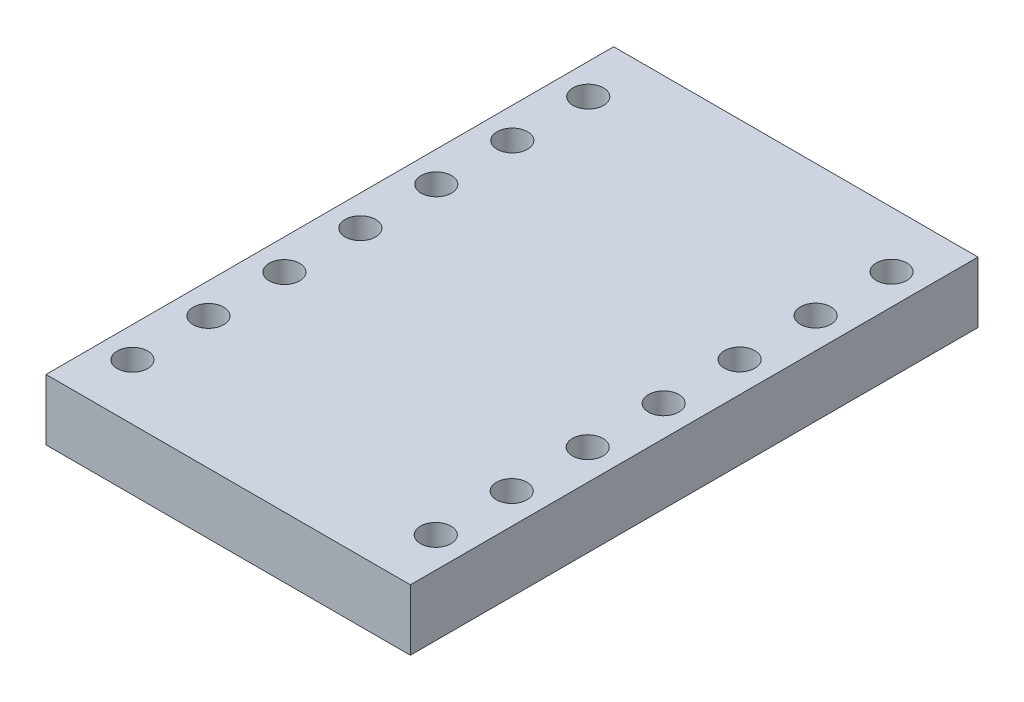
ISO-10303-21;
HEADER;
FILE_DESCRIPTION(('STEP AP214'),'2;1');
FILE_NAME('part.step','',(''),(''),'','','');
FILE_SCHEMA(('AUTOMOTIVE_DESIGN { 1 0 10303 214 1 1 1 1 }'));
ENDSEC;
DATA;
#1=APPLICATION_CONTEXT('core data for automotive mechanical design processes');
#2=APPLICATION_PROTOCOL_DEFINITION('international standard','automotive_design',2000,#1);
#3=PRODUCT_CONTEXT('',#1,'mechanical');
#4=PRODUCT('Part','Part','',(#3));
#5=PRODUCT_RELATED_PRODUCT_CATEGORY('part','',(#4));
#6=PRODUCT_DEFINITION_FORMATION('','',#4);
#7=PRODUCT_DEFINITION_CONTEXT('part definition',#1,'design');
#8=PRODUCT_DEFINITION('design','',#6,#7);
#9=PRODUCT_DEFINITION_SHAPE('','',#8);
#10=(LENGTH_UNIT() NAMED_UNIT(*) SI_UNIT(.MILLI.,.METRE.));
#11=(NAMED_UNIT(*) PLANE_ANGLE_UNIT() SI_UNIT($,.RADIAN.));
#12=(NAMED_UNIT(*) SI_UNIT($,.STERADIAN.) SOLID_ANGLE_UNIT());
#13=UNCERTAINTY_MEASURE_WITH_UNIT(LENGTH_MEASURE(1.E-05),#10,'distance_accuracy_value','');
#14=(GEOMETRIC_REPRESENTATION_CONTEXT(3) GLOBAL_UNCERTAINTY_ASSIGNED_CONTEXT((#13)) GLOBAL_UNIT_ASSIGNED_CONTEXT((#10,
#11,#12)) REPRESENTATION_CONTEXT('',''));
#15=CARTESIAN_POINT('',(0.,0.,0.));
#16=DIRECTION('',(0.,0.,1.));
#17=DIRECTION('',(1.,0.,0.));
#18=AXIS2_PLACEMENT_3D('',#15,#16,#17);
#19=CARTESIAN_POINT('',(0.,10.,0.));
#20=DIRECTION('',(1.,0.,0.));
#21=DIRECTION('',(0.,0.,-1.));
#22=AXIS2_PLACEMENT_3D('',#19,#20,#21);
#23=PLANE('',#22);
#24=CARTESIAN_POINT('',(0.,5.,12.75));
#25=DIRECTION('',(-1.,0.,0.));
#26=DIRECTION('',(0.,0.,1.));
#27=AXIS2_PLACEMENT_3D('',#24,#25,#26);
#28=CIRCLE('',#27,2.75);
#29=CARTESIAN_POINT('',(0.,5.,15.5));
#30=VERTEX_POINT('',#29);
#31=EDGE_CURVE('E167',#30,#30,#28,.T.);
#32=ORIENTED_EDGE('',*,*,#31,.F.);
#33=EDGE_LOOP('',(#32));
#34=FACE_BOUND('',#33,.T.);
#35=CARTESIAN_POINT('',(0.,5.,25.196));
#36=DIRECTION('',(-1.,0.,0.));
#37=DIRECTION('',(0.,0.,1.));
#38=AXIS2_PLACEMENT_3D('',#35,#36,#37);
#39=CIRCLE('',#38,2.75);
#40=CARTESIAN_POINT('',(0.,5.,27.946));
#41=VERTEX_POINT('',#40);
#42=EDGE_CURVE('E306',#41,#41,#39,.T.);
#43=ORIENTED_EDGE('',*,*,#42,.F.);
#44=EDGE_LOOP('',(#43));
#45=FACE_BOUND('',#44,.T.);
#46=CARTESIAN_POINT('',(0.,5.,37.642));
#47=DIRECTION('',(-1.,0.,0.));
#48=DIRECTION('',(0.,0.,1.));
#49=AXIS2_PLACEMENT_3D('',#46,#47,#48);
#50=CIRCLE('',#49,2.75);
#51=CARTESIAN_POINT('',(0.,5.,40.392));
#52=VERTEX_POINT('',#51);
#53=EDGE_CURVE('E310',#52,#52,#50,.T.);
#54=ORIENTED_EDGE('',*,*,#53,.F.);
#55=EDGE_LOOP('',(#54));
#56=FACE_BOUND('',#55,.T.);
#57=CARTESIAN_POINT('',(0.,5.,50.088));
#58=DIRECTION('',(-1.,0.,0.));
#59=DIRECTION('',(0.,0.,1.));
#60=AXIS2_PLACEMENT_3D('',#57,#58,#59);
#61=CIRCLE('',#60,2.75);
#62=CARTESIAN_POINT('',(0.,5.,52.838));
#63=VERTEX_POINT('',#62);
#64=EDGE_CURVE('E314',#63,#63,#61,.T.);
#65=ORIENTED_EDGE('',*,*,#64,.F.);
#66=EDGE_LOOP('',(#65));
#67=FACE_BOUND('',#66,.T.);
#68=DIRECTION('',(0.,0.,1.));
#69=VECTOR('',#68,1.);
#70=CARTESIAN_POINT('',(0.,0.,0.));
#71=LINE('',#70,#69);
#72=CARTESIAN_POINT('',(0.,0.,0.));
#73=VERTEX_POINT('',#72);
#74=CARTESIAN_POINT('',(0.,0.,63.));
#75=VERTEX_POINT('',#74);
#76=EDGE_CURVE('E137',#73,#75,#71,.T.);
#77=ORIENTED_EDGE('',*,*,#76,.T.);
#78=DIRECTION('',(0.,-1.,0.));
#79=VECTOR('',#78,1.);
#80=CARTESIAN_POINT('',(0.,10.,63.));
#81=LINE('',#80,#79);
#82=CARTESIAN_POINT('',(0.,10.,63.));
#83=VERTEX_POINT('',#82);
#84=EDGE_CURVE('E11',#83,#75,#81,.T.);
#85=ORIENTED_EDGE('',*,*,#84,.F.);
#86=DIRECTION('',(0.,0.,1.));
#87=VECTOR('',#86,1.);
#88=CARTESIAN_POINT('',(0.,10.,0.));
#89=LINE('',#88,#87);
#90=CARTESIAN_POINT('',(0.,10.,0.));
#91=VERTEX_POINT('',#90);
#92=EDGE_CURVE('E146',#91,#83,#89,.T.);
#93=ORIENTED_EDGE('',*,*,#92,.F.);
#94=DIRECTION('',(0.,-1.,0.));
#95=VECTOR('',#94,1.);
#96=CARTESIAN_POINT('',(0.,10.,0.));
#97=LINE('',#96,#95);
#98=EDGE_CURVE('E155',#91,#73,#97,.T.);
#99=ORIENTED_EDGE('',*,*,#98,.T.);
#100=EDGE_LOOP('',(#77,#85,#93,#99));
#101=FACE_BOUND('',#100,.T.);
#102=ADVANCED_FACE('F36',(#34,#45,#56,#67,#101),#23,.F.);
#103=CARTESIAN_POINT('',(0.,10.,63.));
#104=DIRECTION('',(0.,0.,-1.));
#105=DIRECTION('',(-1.,0.,0.));
#106=AXIS2_PLACEMENT_3D('',#103,#104,#105);
#107=PLANE('',#106);
#108=DIRECTION('',(1.,0.,0.));
#109=VECTOR('',#108,1.);
#110=CARTESIAN_POINT('',(0.,0.,63.));
#111=LINE('',#110,#109);
#112=CARTESIAN_POINT('',(10.,0.,63.));
#113=VERTEX_POINT('',#112);
#114=EDGE_CURVE('E140',#75,#113,#111,.T.);
#115=ORIENTED_EDGE('',*,*,#114,.T.);
#116=DIRECTION('',(0.,-1.,0.));
#117=VECTOR('',#116,1.);
#118=CARTESIAN_POINT('',(10.,10.,63.));
#119=LINE('',#118,#117);
#120=CARTESIAN_POINT('',(10.,10.,63.));
#121=VERTEX_POINT('',#120);
#122=EDGE_CURVE('E45',#121,#113,#119,.T.);
#123=ORIENTED_EDGE('',*,*,#122,.F.);
#124=DIRECTION('',(1.,0.,0.));
#125=VECTOR('',#124,1.);
#126=CARTESIAN_POINT('',(0.,10.,63.));
#127=LINE('',#126,#125);
#128=EDGE_CURVE('E80',#83,#121,#127,.T.);
#129=ORIENTED_EDGE('',*,*,#128,.F.);
#130=ORIENTED_EDGE('',*,*,#84,.T.);
#131=EDGE_LOOP('',(#115,#123,#129,#130));
#132=FACE_BOUND('',#131,.T.);
#133=ADVANCED_FACE('F294',(#132),#107,.F.);
#134=CARTESIAN_POINT('',(10.,10.,0.));
#135=DIRECTION('',(-1.,0.,0.));
#136=DIRECTION('',(0.,0.,1.));
#137=AXIS2_PLACEMENT_3D('',#134,#135,#136);
#138=PLANE('',#137);
#139=CARTESIAN_POINT('',(10.,5.,12.75));
#140=DIRECTION('',(-1.,0.,0.));
#141=DIRECTION('',(0.,0.,1.));
#142=AXIS2_PLACEMENT_3D('',#139,#140,#141);
#143=CIRCLE('',#142,2.75);
#144=CARTESIAN_POINT('',(10.,5.,15.5));
#145=VERTEX_POINT('',#144);
#146=EDGE_CURVE('E39',#145,#145,#143,.T.);
#147=ORIENTED_EDGE('',*,*,#146,.T.);
#148=EDGE_LOOP('',(#147));
#149=FACE_BOUND('',#148,.T.);
#150=CARTESIAN_POINT('',(10.,5.,25.196));
#151=DIRECTION('',(-1.,0.,0.));
#152=DIRECTION('',(0.,0.,1.));
#153=AXIS2_PLACEMENT_3D('',#150,#151,#152);
#154=CIRCLE('',#153,2.75);
#155=CARTESIAN_POINT('',(10.,5.,27.946));
#156=VERTEX_POINT('',#155);
#157=EDGE_CURVE('E169',#156,#156,#154,.T.);
#158=ORIENTED_EDGE('',*,*,#157,.T.);
#159=EDGE_LOOP('',(#158));
#160=FACE_BOUND('',#159,.T.);
#161=CARTESIAN_POINT('',(10.,5.,37.642));
#162=DIRECTION('',(-1.,0.,0.));
#163=DIRECTION('',(0.,0.,1.));
#164=AXIS2_PLACEMENT_3D('',#161,#162,#163);
#165=CIRCLE('',#164,2.75);
#166=CARTESIAN_POINT('',(10.,5.,40.392));
#167=VERTEX_POINT('',#166);
#168=EDGE_CURVE('E166',#167,#167,#165,.T.);
#169=ORIENTED_EDGE('',*,*,#168,.T.);
#170=EDGE_LOOP('',(#169));
#171=FACE_BOUND('',#170,.T.);
#172=CARTESIAN_POINT('',(10.,5.,50.088));
#173=DIRECTION('',(-1.,0.,0.));
#174=DIRECTION('',(0.,0.,1.));
#175=AXIS2_PLACEMENT_3D('',#172,#173,#174);
#176=CIRCLE('',#175,2.75);
#177=CARTESIAN_POINT('',(10.,5.,52.838));
#178=VERTEX_POINT('',#177);
#179=EDGE_CURVE('E163',#178,#178,#176,.T.);
#180=ORIENTED_EDGE('',*,*,#179,.T.);
#181=EDGE_LOOP('',(#180));
#182=FACE_BOUND('',#181,.T.);
#183=DIRECTION('',(0.,0.,-1.));
#184=VECTOR('',#183,1.);
#185=CARTESIAN_POINT('',(10.,0.,0.));
#186=LINE('',#185,#184);
#187=CARTESIAN_POINT('',(10.,0.,0.));
#188=VERTEX_POINT('',#187);
#189=EDGE_CURVE('E70',#113,#188,#186,.T.);
#190=ORIENTED_EDGE('',*,*,#189,.T.);
#191=DIRECTION('',(0.,-1.,0.));
#192=VECTOR('',#191,1.);
#193=CARTESIAN_POINT('',(10.,10.,0.));
#194=LINE('',#193,#192);
#195=CARTESIAN_POINT('',(10.,10.,0.));
#196=VERTEX_POINT('',#195);
#197=EDGE_CURVE('E54',#196,#188,#194,.T.);
#198=ORIENTED_EDGE('',*,*,#197,.F.);
#199=DIRECTION('',(0.,0.,-1.));
#200=VECTOR('',#199,1.);
#201=CARTESIAN_POINT('',(10.,10.,0.));
#202=LINE('',#201,#200);
#203=EDGE_CURVE('E150',#121,#196,#202,.T.);
#204=ORIENTED_EDGE('',*,*,#203,.F.);
#205=ORIENTED_EDGE('',*,*,#122,.T.);
#206=EDGE_LOOP('',(#190,#198,#204,#205));
#207=FACE_BOUND('',#206,.T.);
#208=ADVANCED_FACE('F299',(#149,#160,#171,#182,#207),#138,.F.);
#209=CARTESIAN_POINT('',(0.,10.,0.));
#210=DIRECTION('',(0.,0.,1.));
#211=DIRECTION('',(1.,0.,0.));
#212=AXIS2_PLACEMENT_3D('',#209,#210,#211);
#213=PLANE('',#212);
#214=DIRECTION('',(-1.,0.,0.));
#215=VECTOR('',#214,1.);
#216=CARTESIAN_POINT('',(0.,0.,0.));
#217=LINE('',#216,#215);
#218=EDGE_CURVE('E75',#188,#73,#217,.T.);
#219=ORIENTED_EDGE('',*,*,#218,.T.);
#220=ORIENTED_EDGE('',*,*,#98,.F.);
#221=DIRECTION('',(-1.,0.,0.));
#222=VECTOR('',#221,1.);
#223=CARTESIAN_POINT('',(0.,10.,0.));
#224=LINE('',#223,#222);
#225=EDGE_CURVE('E153',#196,#91,#224,.T.);
#226=ORIENTED_EDGE('',*,*,#225,.F.);
#227=ORIENTED_EDGE('',*,*,#197,.T.);
#228=EDGE_LOOP('',(#219,#220,#226,#227));
#229=FACE_BOUND('',#228,.T.);
#230=ADVANCED_FACE('F319',(#229),#213,.F.);
#231=CARTESIAN_POINT('',(0.,0.,0.));
#232=DIRECTION('',(0.,1.,0.));
#233=DIRECTION('',(0.,0.,1.));
#234=AXIS2_PLACEMENT_3D('',#231,#232,#233);
#235=PLANE('',#234);
#236=ORIENTED_EDGE('',*,*,#76,.F.);
#237=ORIENTED_EDGE('',*,*,#218,.F.);
#238=ORIENTED_EDGE('',*,*,#189,.F.);
#239=ORIENTED_EDGE('',*,*,#114,.F.);
#240=EDGE_LOOP('',(#236,#237,#238,#239));
#241=FACE_BOUND('',#240,.T.);
#242=ADVANCED_FACE('F317',(#241),#235,.F.);
#243=CARTESIAN_POINT('',(0.,10.,0.));
#244=DIRECTION('',(0.,1.,0.));
#245=DIRECTION('',(0.,0.,1.));
#246=AXIS2_PLACEMENT_3D('',#243,#244,#245);
#247=PLANE('',#246);
#248=DIRECTION('',(0.,0.,1.));
#249=VECTOR('',#248,1.);
#250=CARTESIAN_POINT('',(-24.845,10.,78.));
#251=LINE('',#250,#249);
#252=CARTESIAN_POINT('',(-24.845,10.,-15.));
#253=VERTEX_POINT('',#252);
#254=CARTESIAN_POINT('',(-24.845,10.,78.));
#255=VERTEX_POINT('',#254);
#256=EDGE_CURVE('E136',#253,#255,#251,.T.);
#257=ORIENTED_EDGE('',*,*,#256,.F.);
#258=DIRECTION('',(-1.,0.,0.));
#259=VECTOR('',#258,1.);
#260=CARTESIAN_POINT('',(34.845,10.,-15.));
#261=LINE('',#260,#259);
#262=CARTESIAN_POINT('',(34.845,10.,-15.));
#263=VERTEX_POINT('',#262);
#264=EDGE_CURVE('E132',#263,#253,#261,.T.);
#265=ORIENTED_EDGE('',*,*,#264,.F.);
#266=DIRECTION('',(0.,0.,-1.));
#267=VECTOR('',#266,1.);
#268=CARTESIAN_POINT('',(34.845,10.,78.));
#269=LINE('',#268,#267);
#270=CARTESIAN_POINT('',(34.845,10.,78.));
#271=VERTEX_POINT('',#270);
#272=EDGE_CURVE('E270',#271,#263,#269,.T.);
#273=ORIENTED_EDGE('',*,*,#272,.F.);
#274=DIRECTION('',(1.,0.,0.));
#275=VECTOR('',#274,1.);
#276=CARTESIAN_POINT('',(34.845,10.,78.));
#277=LINE('',#276,#275);
#278=EDGE_CURVE('E268',#255,#271,#277,.T.);
#279=ORIENTED_EDGE('',*,*,#278,.F.);
#280=EDGE_LOOP('',(#257,#265,#273,#279));
#281=FACE_BOUND('',#280,.T.);
#282=CARTESIAN_POINT('',(-19.845,10.,-5.83800003600001));
#283=DIRECTION('',(0.,1.,0.));
#284=DIRECTION('',(0.,0.,1.));
#285=AXIS2_PLACEMENT_3D('',#282,#283,#284);
#286=CIRCLE('',#285,2.5);
#287=CARTESIAN_POINT('',(-19.845,10.,-3.338000036));
#288=VERTEX_POINT('',#287);
#289=EDGE_CURVE('E256',#288,#288,#286,.T.);
#290=ORIENTED_EDGE('',*,*,#289,.T.);
#291=EDGE_LOOP('',(#290));
#292=FACE_BOUND('',#291,.T.);
#293=CARTESIAN_POINT('',(-19.8449999999999,10.,6.60799996399999));
#294=DIRECTION('',(0.,1.,0.));
#295=DIRECTION('',(0.,0.,1.));
#296=AXIS2_PLACEMENT_3D('',#293,#294,#295);
#297=CIRCLE('',#296,2.5);
#298=CARTESIAN_POINT('',(-19.8449999999999,10.,9.10799996399999));
#299=VERTEX_POINT('',#298);
#300=EDGE_CURVE('E250',#299,#299,#297,.T.);
#301=ORIENTED_EDGE('',*,*,#300,.T.);
#302=EDGE_LOOP('',(#301));
#303=FACE_BOUND('',#302,.T.);
#304=CARTESIAN_POINT('',(-19.8449999999997,10.,19.053999964));
#305=DIRECTION('',(0.,1.,0.));
#306=DIRECTION('',(0.,0.,1.));
#307=AXIS2_PLACEMENT_3D('',#304,#305,#306);
#308=CIRCLE('',#307,2.5);
#309=CARTESIAN_POINT('',(-19.8449999999997,10.,21.553999964));
#310=VERTEX_POINT('',#309);
#311=EDGE_CURVE('E244',#310,#310,#308,.T.);
#312=ORIENTED_EDGE('',*,*,#311,.T.);
#313=EDGE_LOOP('',(#312));
#314=FACE_BOUND('',#313,.T.);
#315=CARTESIAN_POINT('',(-19.8449999999996,10.,31.499999964));
#316=DIRECTION('',(0.,1.,0.));
#317=DIRECTION('',(0.,0.,1.));
#318=AXIS2_PLACEMENT_3D('',#315,#316,#317);
#319=CIRCLE('',#318,2.5);
#320=CARTESIAN_POINT('',(-19.8449999999996,10.,33.999999964));
#321=VERTEX_POINT('',#320);
#322=EDGE_CURVE('E238',#321,#321,#319,.T.);
#323=ORIENTED_EDGE('',*,*,#322,.T.);
#324=EDGE_LOOP('',(#323));
#325=FACE_BOUND('',#324,.T.);
#326=CARTESIAN_POINT('',(-19.8449999999995,10.,43.945999964));
#327=DIRECTION('',(0.,1.,0.));
#328=DIRECTION('',(0.,0.,1.));
#329=AXIS2_PLACEMENT_3D('',#326,#327,#328);
#330=CIRCLE('',#329,2.5);
#331=CARTESIAN_POINT('',(-19.8449999999995,10.,46.445999964));
#332=VERTEX_POINT('',#331);
#333=EDGE_CURVE('E232',#332,#332,#330,.T.);
#334=ORIENTED_EDGE('',*,*,#333,.T.);
#335=EDGE_LOOP('',(#334));
#336=FACE_BOUND('',#335,.T.);
#337=CARTESIAN_POINT('',(-19.8449999999993,10.,56.391999964));
#338=DIRECTION('',(0.,1.,0.));
#339=DIRECTION('',(0.,0.,1.));
#340=AXIS2_PLACEMENT_3D('',#337,#338,#339);
#341=CIRCLE('',#340,2.5);
#342=CARTESIAN_POINT('',(-19.8449999999993,10.,58.891999964));
#343=VERTEX_POINT('',#342);
#344=EDGE_CURVE('E226',#343,#343,#341,.T.);
#345=ORIENTED_EDGE('',*,*,#344,.T.);
#346=EDGE_LOOP('',(#345));
#347=FACE_BOUND('',#346,.T.);
#348=CARTESIAN_POINT('',(-19.8449999999992,10.,68.837999964));
#349=DIRECTION('',(0.,1.,0.));
#350=DIRECTION('',(0.,0.,1.));
#351=AXIS2_PLACEMENT_3D('',#348,#349,#350);
#352=CIRCLE('',#351,2.5);
#353=CARTESIAN_POINT('',(-19.8449999999992,10.,71.337999964));
#354=VERTEX_POINT('',#353);
#355=EDGE_CURVE('E220',#354,#354,#352,.T.);
#356=ORIENTED_EDGE('',*,*,#355,.T.);
#357=EDGE_LOOP('',(#356));
#358=FACE_BOUND('',#357,.T.);
#359=CARTESIAN_POINT('',(29.845,10.,-5.838000036));
#360=DIRECTION('',(0.,1.,0.));
#361=DIRECTION('',(0.,0.,1.));
#362=AXIS2_PLACEMENT_3D('',#359,#360,#361);
#363=CIRCLE('',#362,2.49999999999999);
#364=CARTESIAN_POINT('',(29.845,10.,-3.33800003600001));
#365=VERTEX_POINT('',#364);
#366=EDGE_CURVE('E214',#365,#365,#363,.T.);
#367=ORIENTED_EDGE('',*,*,#366,.T.);
#368=EDGE_LOOP('',(#367));
#369=FACE_BOUND('',#368,.T.);
#370=CARTESIAN_POINT('',(29.8450000000001,10.,6.60799996399999));
#371=DIRECTION('',(0.,1.,0.));
#372=DIRECTION('',(0.,0.,1.));
#373=AXIS2_PLACEMENT_3D('',#370,#371,#372);
#374=CIRCLE('',#373,2.49999999999999);
#375=CARTESIAN_POINT('',(29.8450000000001,10.,9.10799996399999));
#376=VERTEX_POINT('',#375);
#377=EDGE_CURVE('E208',#376,#376,#374,.T.);
#378=ORIENTED_EDGE('',*,*,#377,.T.);
#379=EDGE_LOOP('',(#378));
#380=FACE_BOUND('',#379,.T.);
#381=CARTESIAN_POINT('',(29.8450000000003,10.,19.053999964));
#382=DIRECTION('',(0.,1.,0.));
#383=DIRECTION('',(0.,0.,1.));
#384=AXIS2_PLACEMENT_3D('',#381,#382,#383);
#385=CIRCLE('',#384,2.5);
#386=CARTESIAN_POINT('',(29.8450000000003,10.,21.553999964));
#387=VERTEX_POINT('',#386);
#388=EDGE_CURVE('E202',#387,#387,#385,.T.);
#389=ORIENTED_EDGE('',*,*,#388,.T.);
#390=EDGE_LOOP('',(#389));
#391=FACE_BOUND('',#390,.T.);
#392=CARTESIAN_POINT('',(29.8450000000004,10.,31.499999964));
#393=DIRECTION('',(0.,1.,0.));
#394=DIRECTION('',(0.,0.,1.));
#395=AXIS2_PLACEMENT_3D('',#392,#393,#394);
#396=CIRCLE('',#395,2.5);
#397=CARTESIAN_POINT('',(29.8450000000004,10.,33.999999964));
#398=VERTEX_POINT('',#397);
#399=EDGE_CURVE('E196',#398,#398,#396,.T.);
#400=ORIENTED_EDGE('',*,*,#399,.T.);
#401=EDGE_LOOP('',(#400));
#402=FACE_BOUND('',#401,.T.);
#403=CARTESIAN_POINT('',(29.8450000000005,10.,43.945999964));
#404=DIRECTION('',(0.,1.,0.));
#405=DIRECTION('',(0.,0.,1.));
#406=AXIS2_PLACEMENT_3D('',#403,#404,#405);
#407=CIRCLE('',#406,2.5);
#408=CARTESIAN_POINT('',(29.8450000000005,10.,46.445999964));
#409=VERTEX_POINT('',#408);
#410=EDGE_CURVE('E190',#409,#409,#407,.T.);
#411=ORIENTED_EDGE('',*,*,#410,.T.);
#412=EDGE_LOOP('',(#411));
#413=FACE_BOUND('',#412,.T.);
#414=CARTESIAN_POINT('',(29.8450000000007,10.,56.391999964));
#415=DIRECTION('',(0.,1.,0.));
#416=DIRECTION('',(0.,0.,1.));
#417=AXIS2_PLACEMENT_3D('',#414,#415,#416);
#418=CIRCLE('',#417,2.5);
#419=CARTESIAN_POINT('',(29.8450000000007,10.,58.891999964));
#420=VERTEX_POINT('',#419);
#421=EDGE_CURVE('E183',#420,#420,#418,.T.);
#422=ORIENTED_EDGE('',*,*,#421,.T.);
#423=EDGE_LOOP('',(#422));
#424=FACE_BOUND('',#423,.T.);
#425=CARTESIAN_POINT('',(29.8450000000008,10.,68.837999964));
#426=DIRECTION('',(0.,1.,0.));
#427=DIRECTION('',(0.,0.,1.));
#428=AXIS2_PLACEMENT_3D('',#425,#426,#427);
#429=CIRCLE('',#428,2.5);
#430=CARTESIAN_POINT('',(29.8450000000008,10.,71.337999964));
#431=VERTEX_POINT('',#430);
#432=EDGE_CURVE('E174',#431,#431,#429,.T.);
#433=ORIENTED_EDGE('',*,*,#432,.T.);
#434=EDGE_LOOP('',(#433));
#435=FACE_BOUND('',#434,.T.);
#436=ORIENTED_EDGE('',*,*,#225,.T.);
#437=ORIENTED_EDGE('',*,*,#92,.T.);
#438=ORIENTED_EDGE('',*,*,#128,.T.);
#439=ORIENTED_EDGE('',*,*,#203,.T.);
#440=EDGE_LOOP('',(#436,#437,#438,#439));
#441=FACE_BOUND('',#440,.T.);
#442=ADVANCED_FACE('F281',(#281,#292,#303,#314,#325,#336,#347,#358,#369,#380,#391,#402,#413,
#424,#435,#441),#247,.F.);
#443=CARTESIAN_POINT('',(0.,20.,0.));
#444=DIRECTION('',(0.,1.,0.));
#445=DIRECTION('',(0.,0.,1.));
#446=AXIS2_PLACEMENT_3D('',#443,#444,#445);
#447=PLANE('',#446);
#448=CARTESIAN_POINT('',(29.8450000000007,20.,56.391999964));
#449=DIRECTION('',(0.,1.,0.));
#450=DIRECTION('',(0.,0.,1.));
#451=AXIS2_PLACEMENT_3D('',#448,#449,#450);
#452=CIRCLE('',#451,2.5);
#453=CARTESIAN_POINT('',(29.8450000000007,20.,58.891999964));
#454=VERTEX_POINT('',#453);
#455=EDGE_CURVE('E187',#454,#454,#452,.T.);
#456=ORIENTED_EDGE('',*,*,#455,.F.);
#457=EDGE_LOOP('',(#456));
#458=FACE_BOUND('',#457,.T.);
#459=CARTESIAN_POINT('',(29.8450000000004,20.,31.499999964));
#460=DIRECTION('',(0.,1.,0.));
#461=DIRECTION('',(0.,0.,1.));
#462=AXIS2_PLACEMENT_3D('',#459,#460,#461);
#463=CIRCLE('',#462,2.5);
#464=CARTESIAN_POINT('',(29.8450000000004,20.,33.999999964));
#465=VERTEX_POINT('',#464);
#466=EDGE_CURVE('E199',#465,#465,#463,.T.);
#467=ORIENTED_EDGE('',*,*,#466,.F.);
#468=EDGE_LOOP('',(#467));
#469=FACE_BOUND('',#468,.T.);
#470=CARTESIAN_POINT('',(29.8450000000001,20.,6.60799996399999));
#471=DIRECTION('',(0.,1.,0.));
#472=DIRECTION('',(0.,0.,1.));
#473=AXIS2_PLACEMENT_3D('',#470,#471,#472);
#474=CIRCLE('',#473,2.49999999999999);
#475=CARTESIAN_POINT('',(29.8450000000001,20.,9.10799996399999));
#476=VERTEX_POINT('',#475);
#477=EDGE_CURVE('E211',#476,#476,#474,.T.);
#478=ORIENTED_EDGE('',*,*,#477,.F.);
#479=EDGE_LOOP('',(#478));
#480=FACE_BOUND('',#479,.T.);
#481=CARTESIAN_POINT('',(-19.8449999999992,20.,68.837999964));
#482=DIRECTION('',(0.,1.,0.));
#483=DIRECTION('',(0.,0.,1.));
#484=AXIS2_PLACEMENT_3D('',#481,#482,#483);
#485=CIRCLE('',#484,2.5);
#486=CARTESIAN_POINT('',(-19.8449999999992,20.,71.337999964));
#487=VERTEX_POINT('',#486);
#488=EDGE_CURVE('E223',#487,#487,#485,.T.);
#489=ORIENTED_EDGE('',*,*,#488,.F.);
#490=EDGE_LOOP('',(#489));
#491=FACE_BOUND('',#490,.T.);
#492=CARTESIAN_POINT('',(-19.8449999999995,20.,43.945999964));
#493=DIRECTION('',(0.,1.,0.));
#494=DIRECTION('',(0.,0.,1.));
#495=AXIS2_PLACEMENT_3D('',#492,#493,#494);
#496=CIRCLE('',#495,2.5);
#497=CARTESIAN_POINT('',(-19.8449999999995,20.,46.445999964));
#498=VERTEX_POINT('',#497);
#499=EDGE_CURVE('E235',#498,#498,#496,.T.);
#500=ORIENTED_EDGE('',*,*,#499,.F.);
#501=EDGE_LOOP('',(#500));
#502=FACE_BOUND('',#501,.T.);
#503=CARTESIAN_POINT('',(-19.8449999999997,20.,19.053999964));
#504=DIRECTION('',(0.,1.,0.));
#505=DIRECTION('',(0.,0.,1.));
#506=AXIS2_PLACEMENT_3D('',#503,#504,#505);
#507=CIRCLE('',#506,2.5);
#508=CARTESIAN_POINT('',(-19.8449999999997,20.,21.553999964));
#509=VERTEX_POINT('',#508);
#510=EDGE_CURVE('E247',#509,#509,#507,.T.);
#511=ORIENTED_EDGE('',*,*,#510,.F.);
#512=EDGE_LOOP('',(#511));
#513=FACE_BOUND('',#512,.T.);
#514=CARTESIAN_POINT('',(-19.845,20.,-5.83800003600001));
#515=DIRECTION('',(0.,1.,0.));
#516=DIRECTION('',(0.,0.,1.));
#517=AXIS2_PLACEMENT_3D('',#514,#515,#516);
#518=CIRCLE('',#517,2.5);
#519=CARTESIAN_POINT('',(-19.845,20.,-3.338000036));
#520=VERTEX_POINT('',#519);
#521=EDGE_CURVE('E259',#520,#520,#518,.T.);
#522=ORIENTED_EDGE('',*,*,#521,.F.);
#523=EDGE_LOOP('',(#522));
#524=FACE_BOUND('',#523,.T.);
#525=DIRECTION('',(0.,0.,1.));
#526=VECTOR('',#525,1.);
#527=CARTESIAN_POINT('',(-24.845,20.,78.));
#528=LINE('',#527,#526);
#529=CARTESIAN_POINT('',(-24.845,20.,-15.));
#530=VERTEX_POINT('',#529);
#531=CARTESIAN_POINT('',(-24.845,20.,78.));
#532=VERTEX_POINT('',#531);
#533=EDGE_CURVE('E122',#530,#532,#528,.T.);
#534=ORIENTED_EDGE('',*,*,#533,.T.);
#535=DIRECTION('',(1.,0.,0.));
#536=VECTOR('',#535,1.);
#537=CARTESIAN_POINT('',(34.845,20.,78.));
#538=LINE('',#537,#536);
#539=CARTESIAN_POINT('',(34.845,20.,78.));
#540=VERTEX_POINT('',#539);
#541=EDGE_CURVE('E111',#532,#540,#538,.T.);
#542=ORIENTED_EDGE('',*,*,#541,.T.);
#543=DIRECTION('',(0.,0.,-1.));
#544=VECTOR('',#543,1.);
#545=CARTESIAN_POINT('',(34.845,20.,78.));
#546=LINE('',#545,#544);
#547=CARTESIAN_POINT('',(34.845,20.,-15.));
#548=VERTEX_POINT('',#547);
#549=EDGE_CURVE('E121',#540,#548,#546,.T.);
#550=ORIENTED_EDGE('',*,*,#549,.T.);
#551=DIRECTION('',(-1.,0.,0.));
#552=VECTOR('',#551,1.);
#553=CARTESIAN_POINT('',(34.845,20.,-15.));
#554=LINE('',#553,#552);
#555=EDGE_CURVE('E128',#548,#530,#554,.T.);
#556=ORIENTED_EDGE('',*,*,#555,.T.);
#557=EDGE_LOOP('',(#534,#542,#550,#556));
#558=FACE_BOUND('',#557,.T.);
#559=CARTESIAN_POINT('',(-19.8449999999999,20.,6.60799996399999));
#560=DIRECTION('',(0.,1.,0.));
#561=DIRECTION('',(0.,0.,1.));
#562=AXIS2_PLACEMENT_3D('',#559,#560,#561);
#563=CIRCLE('',#562,2.5);
#564=CARTESIAN_POINT('',(-19.8449999999999,20.,9.10799996399999));
#565=VERTEX_POINT('',#564);
#566=EDGE_CURVE('E253',#565,#565,#563,.T.);
#567=ORIENTED_EDGE('',*,*,#566,.F.);
#568=EDGE_LOOP('',(#567));
#569=FACE_BOUND('',#568,.T.);
#570=CARTESIAN_POINT('',(-19.8449999999996,20.,31.499999964));
#571=DIRECTION('',(0.,1.,0.));
#572=DIRECTION('',(0.,0.,1.));
#573=AXIS2_PLACEMENT_3D('',#570,#571,#572);
#574=CIRCLE('',#573,2.5);
#575=CARTESIAN_POINT('',(-19.8449999999996,20.,33.999999964));
#576=VERTEX_POINT('',#575);
#577=EDGE_CURVE('E241',#576,#576,#574,.T.);
#578=ORIENTED_EDGE('',*,*,#577,.F.);
#579=EDGE_LOOP('',(#578));
#580=FACE_BOUND('',#579,.T.);
#581=CARTESIAN_POINT('',(-19.8449999999993,20.,56.391999964));
#582=DIRECTION('',(0.,1.,0.));
#583=DIRECTION('',(0.,0.,1.));
#584=AXIS2_PLACEMENT_3D('',#581,#582,#583);
#585=CIRCLE('',#584,2.5);
#586=CARTESIAN_POINT('',(-19.8449999999993,20.,58.891999964));
#587=VERTEX_POINT('',#586);
#588=EDGE_CURVE('E229',#587,#587,#585,.T.);
#589=ORIENTED_EDGE('',*,*,#588,.F.);
#590=EDGE_LOOP('',(#589));
#591=FACE_BOUND('',#590,.T.);
#592=CARTESIAN_POINT('',(29.845,20.,-5.838000036));
#593=DIRECTION('',(0.,1.,0.));
#594=DIRECTION('',(0.,0.,1.));
#595=AXIS2_PLACEMENT_3D('',#592,#593,#594);
#596=CIRCLE('',#595,2.49999999999999);
#597=CARTESIAN_POINT('',(29.845,20.,-3.33800003600001));
#598=VERTEX_POINT('',#597);
#599=EDGE_CURVE('E217',#598,#598,#596,.T.);
#600=ORIENTED_EDGE('',*,*,#599,.F.);
#601=EDGE_LOOP('',(#600));
#602=FACE_BOUND('',#601,.T.);
#603=CARTESIAN_POINT('',(29.8450000000003,20.,19.053999964));
#604=DIRECTION('',(0.,1.,0.));
#605=DIRECTION('',(0.,0.,1.));
#606=AXIS2_PLACEMENT_3D('',#603,#604,#605);
#607=CIRCLE('',#606,2.5);
#608=CARTESIAN_POINT('',(29.8450000000003,20.,21.553999964));
#609=VERTEX_POINT('',#608);
#610=EDGE_CURVE('E205',#609,#609,#607,.T.);
#611=ORIENTED_EDGE('',*,*,#610,.F.);
#612=EDGE_LOOP('',(#611));
#613=FACE_BOUND('',#612,.T.);
#614=CARTESIAN_POINT('',(29.8450000000005,20.,43.945999964));
#615=DIRECTION('',(0.,1.,0.));
#616=DIRECTION('',(0.,0.,1.));
#617=AXIS2_PLACEMENT_3D('',#614,#615,#616);
#618=CIRCLE('',#617,2.5);
#619=CARTESIAN_POINT('',(29.8450000000005,20.,46.445999964));
#620=VERTEX_POINT('',#619);
#621=EDGE_CURVE('E193',#620,#620,#618,.T.);
#622=ORIENTED_EDGE('',*,*,#621,.F.);
#623=EDGE_LOOP('',(#622));
#624=FACE_BOUND('',#623,.T.);
#625=CARTESIAN_POINT('',(29.8450000000008,20.,68.837999964));
#626=DIRECTION('',(0.,1.,0.));
#627=DIRECTION('',(0.,0.,1.));
#628=AXIS2_PLACEMENT_3D('',#625,#626,#627);
#629=CIRCLE('',#628,2.5);
#630=CARTESIAN_POINT('',(29.8450000000008,20.,71.337999964));
#631=VERTEX_POINT('',#630);
#632=EDGE_CURVE('E178',#631,#631,#629,.T.);
#633=ORIENTED_EDGE('',*,*,#632,.F.);
#634=EDGE_LOOP('',(#633));
#635=FACE_BOUND('',#634,.T.);
#636=ADVANCED_FACE('F125',(#458,#469,#480,#491,#502,#513,#524,#558,#569,#580,#591,#602,#613,
#624,#635),#447,.T.);
#637=CARTESIAN_POINT('',(-24.845,20.,78.));
#638=DIRECTION('',(1.,0.,0.));
#639=DIRECTION('',(0.,0.,-1.));
#640=AXIS2_PLACEMENT_3D('',#637,#638,#639);
#641=PLANE('',#640);
#642=ORIENTED_EDGE('',*,*,#256,.T.);
#643=DIRECTION('',(0.,-1.,0.));
#644=VECTOR('',#643,1.);
#645=CARTESIAN_POINT('',(-24.845,20.,78.));
#646=LINE('',#645,#644);
#647=EDGE_CURVE('E115',#532,#255,#646,.T.);
#648=ORIENTED_EDGE('',*,*,#647,.F.);
#649=ORIENTED_EDGE('',*,*,#533,.F.);
#650=DIRECTION('',(0.,-1.,0.));
#651=VECTOR('',#650,1.);
#652=CARTESIAN_POINT('',(-24.845,20.,-15.));
#653=LINE('',#652,#651);
#654=EDGE_CURVE('E266',#530,#253,#653,.T.);
#655=ORIENTED_EDGE('',*,*,#654,.T.);
#656=EDGE_LOOP('',(#642,#648,#649,#655));
#657=FACE_BOUND('',#656,.T.);
#658=ADVANCED_FACE('F134',(#657),#641,.F.);
#659=CARTESIAN_POINT('',(34.845,20.,78.));
#660=DIRECTION('',(0.,0.,-1.));
#661=DIRECTION('',(-1.,0.,0.));
#662=AXIS2_PLACEMENT_3D('',#659,#660,#661);
#663=PLANE('',#662);
#664=ORIENTED_EDGE('',*,*,#278,.T.);
#665=DIRECTION('',(0.,-1.,0.));
#666=VECTOR('',#665,1.);
#667=CARTESIAN_POINT('',(34.845,20.,78.));
#668=LINE('',#667,#666);
#669=EDGE_CURVE('E118',#540,#271,#668,.T.);
#670=ORIENTED_EDGE('',*,*,#669,.F.);
#671=ORIENTED_EDGE('',*,*,#541,.F.);
#672=ORIENTED_EDGE('',*,*,#647,.T.);
#673=EDGE_LOOP('',(#664,#670,#671,#672));
#674=FACE_BOUND('',#673,.T.);
#675=ADVANCED_FACE('F113',(#674),#663,.F.);
#676=CARTESIAN_POINT('',(34.845,20.,78.));
#677=DIRECTION('',(-1.,0.,0.));
#678=DIRECTION('',(0.,0.,1.));
#679=AXIS2_PLACEMENT_3D('',#676,#677,#678);
#680=PLANE('',#679);
#681=ORIENTED_EDGE('',*,*,#272,.T.);
#682=DIRECTION('',(0.,-1.,0.));
#683=VECTOR('',#682,1.);
#684=CARTESIAN_POINT('',(34.845,20.,-15.));
#685=LINE('',#684,#683);
#686=EDGE_CURVE('E142',#548,#263,#685,.T.);
#687=ORIENTED_EDGE('',*,*,#686,.F.);
#688=ORIENTED_EDGE('',*,*,#549,.F.);
#689=ORIENTED_EDGE('',*,*,#669,.T.);
#690=EDGE_LOOP('',(#681,#687,#688,#689));
#691=FACE_BOUND('',#690,.T.);
#692=ADVANCED_FACE('F283',(#691),#680,.F.);
#693=CARTESIAN_POINT('',(34.845,20.,-15.));
#694=DIRECTION('',(0.,0.,1.));
#695=DIRECTION('',(1.,0.,0.));
#696=AXIS2_PLACEMENT_3D('',#693,#694,#695);
#697=PLANE('',#696);
#698=ORIENTED_EDGE('',*,*,#264,.T.);
#699=ORIENTED_EDGE('',*,*,#654,.F.);
#700=ORIENTED_EDGE('',*,*,#555,.F.);
#701=ORIENTED_EDGE('',*,*,#686,.T.);
#702=EDGE_LOOP('',(#698,#699,#700,#701));
#703=FACE_BOUND('',#702,.T.);
#704=ADVANCED_FACE('F277',(#703),#697,.F.);
#705=CARTESIAN_POINT('',(-19.845,20.,-5.83800003600001));
#706=DIRECTION('',(0.,-1.,0.));
#707=DIRECTION('',(0.,0.,-1.));
#708=AXIS2_PLACEMENT_3D('',#705,#706,#707);
#709=CYLINDRICAL_SURFACE('',#708,2.5);
#710=ORIENTED_EDGE('',*,*,#521,.T.);
#711=EDGE_LOOP('',(#710));
#712=FACE_BOUND('',#711,.T.);
#713=ORIENTED_EDGE('',*,*,#289,.F.);
#714=EDGE_LOOP('',(#713));
#715=FACE_BOUND('',#714,.T.);
#716=ADVANCED_FACE('F290',(#712,#715),#709,.F.);
#717=CARTESIAN_POINT('',(-19.8449999999999,20.,6.60799996399999));
#718=DIRECTION('',(0.,-1.,0.));
#719=DIRECTION('',(0.,0.,-1.));
#720=AXIS2_PLACEMENT_3D('',#717,#718,#719);
#721=CYLINDRICAL_SURFACE('',#720,2.5);
#722=ORIENTED_EDGE('',*,*,#566,.T.);
#723=EDGE_LOOP('',(#722));
#724=FACE_BOUND('',#723,.T.);
#725=ORIENTED_EDGE('',*,*,#300,.F.);
#726=EDGE_LOOP('',(#725));
#727=FACE_BOUND('',#726,.T.);
#728=ADVANCED_FACE('F344',(#724,#727),#721,.F.);
#729=CARTESIAN_POINT('',(-19.8449999999997,20.,19.053999964));
#730=DIRECTION('',(0.,-1.,0.));
#731=DIRECTION('',(0.,0.,-1.));
#732=AXIS2_PLACEMENT_3D('',#729,#730,#731);
#733=CYLINDRICAL_SURFACE('',#732,2.5);
#734=ORIENTED_EDGE('',*,*,#510,.T.);
#735=EDGE_LOOP('',(#734));
#736=FACE_BOUND('',#735,.T.);
#737=ORIENTED_EDGE('',*,*,#311,.F.);
#738=EDGE_LOOP('',(#737));
#739=FACE_BOUND('',#738,.T.);
#740=ADVANCED_FACE('F348',(#736,#739),#733,.F.);
#741=CARTESIAN_POINT('',(-19.8449999999996,20.,31.499999964));
#742=DIRECTION('',(0.,-1.,0.));
#743=DIRECTION('',(0.,0.,-1.));
#744=AXIS2_PLACEMENT_3D('',#741,#742,#743);
#745=CYLINDRICAL_SURFACE('',#744,2.5);
#746=ORIENTED_EDGE('',*,*,#577,.T.);
#747=EDGE_LOOP('',(#746));
#748=FACE_BOUND('',#747,.T.);
#749=ORIENTED_EDGE('',*,*,#322,.F.);
#750=EDGE_LOOP('',(#749));
#751=FACE_BOUND('',#750,.T.);
#752=ADVANCED_FACE('F352',(#748,#751),#745,.F.);
#753=CARTESIAN_POINT('',(-19.8449999999995,20.,43.945999964));
#754=DIRECTION('',(0.,-1.,0.));
#755=DIRECTION('',(0.,0.,-1.));
#756=AXIS2_PLACEMENT_3D('',#753,#754,#755);
#757=CYLINDRICAL_SURFACE('',#756,2.5);
#758=ORIENTED_EDGE('',*,*,#499,.T.);
#759=EDGE_LOOP('',(#758));
#760=FACE_BOUND('',#759,.T.);
#761=ORIENTED_EDGE('',*,*,#333,.F.);
#762=EDGE_LOOP('',(#761));
#763=FACE_BOUND('',#762,.T.);
#764=ADVANCED_FACE('F356',(#760,#763),#757,.F.);
#765=CARTESIAN_POINT('',(-19.8449999999993,20.,56.391999964));
#766=DIRECTION('',(0.,-1.,0.));
#767=DIRECTION('',(0.,0.,-1.));
#768=AXIS2_PLACEMENT_3D('',#765,#766,#767);
#769=CYLINDRICAL_SURFACE('',#768,2.5);
#770=ORIENTED_EDGE('',*,*,#588,.T.);
#771=EDGE_LOOP('',(#770));
#772=FACE_BOUND('',#771,.T.);
#773=ORIENTED_EDGE('',*,*,#344,.F.);
#774=EDGE_LOOP('',(#773));
#775=FACE_BOUND('',#774,.T.);
#776=ADVANCED_FACE('F360',(#772,#775),#769,.F.);
#777=CARTESIAN_POINT('',(-19.8449999999992,20.,68.837999964));
#778=DIRECTION('',(0.,-1.,0.));
#779=DIRECTION('',(0.,0.,-1.));
#780=AXIS2_PLACEMENT_3D('',#777,#778,#779);
#781=CYLINDRICAL_SURFACE('',#780,2.5);
#782=ORIENTED_EDGE('',*,*,#488,.T.);
#783=EDGE_LOOP('',(#782));
#784=FACE_BOUND('',#783,.T.);
#785=ORIENTED_EDGE('',*,*,#355,.F.);
#786=EDGE_LOOP('',(#785));
#787=FACE_BOUND('',#786,.T.);
#788=ADVANCED_FACE('F364',(#784,#787),#781,.F.);
#789=CARTESIAN_POINT('',(29.845,20.,-5.838000036));
#790=DIRECTION('',(0.,-1.,0.));
#791=DIRECTION('',(0.,0.,-1.));
#792=AXIS2_PLACEMENT_3D('',#789,#790,#791);
#793=CYLINDRICAL_SURFACE('',#792,2.49999999999999);
#794=ORIENTED_EDGE('',*,*,#599,.T.);
#795=EDGE_LOOP('',(#794));
#796=FACE_BOUND('',#795,.T.);
#797=ORIENTED_EDGE('',*,*,#366,.F.);
#798=EDGE_LOOP('',(#797));
#799=FACE_BOUND('',#798,.T.);
#800=ADVANCED_FACE('F368',(#796,#799),#793,.F.);
#801=CARTESIAN_POINT('',(29.8450000000001,20.,6.60799996399999));
#802=DIRECTION('',(0.,-1.,0.));
#803=DIRECTION('',(0.,0.,-1.));
#804=AXIS2_PLACEMENT_3D('',#801,#802,#803);
#805=CYLINDRICAL_SURFACE('',#804,2.49999999999999);
#806=ORIENTED_EDGE('',*,*,#477,.T.);
#807=EDGE_LOOP('',(#806));
#808=FACE_BOUND('',#807,.T.);
#809=ORIENTED_EDGE('',*,*,#377,.F.);
#810=EDGE_LOOP('',(#809));
#811=FACE_BOUND('',#810,.T.);
#812=ADVANCED_FACE('F372',(#808,#811),#805,.F.);
#813=CARTESIAN_POINT('',(29.8450000000003,20.,19.053999964));
#814=DIRECTION('',(0.,-1.,0.));
#815=DIRECTION('',(0.,0.,-1.));
#816=AXIS2_PLACEMENT_3D('',#813,#814,#815);
#817=CYLINDRICAL_SURFACE('',#816,2.5);
#818=ORIENTED_EDGE('',*,*,#610,.T.);
#819=EDGE_LOOP('',(#818));
#820=FACE_BOUND('',#819,.T.);
#821=ORIENTED_EDGE('',*,*,#388,.F.);
#822=EDGE_LOOP('',(#821));
#823=FACE_BOUND('',#822,.T.);
#824=ADVANCED_FACE('F376',(#820,#823),#817,.F.);
#825=CARTESIAN_POINT('',(29.8450000000004,20.,31.499999964));
#826=DIRECTION('',(0.,-1.,0.));
#827=DIRECTION('',(0.,0.,-1.));
#828=AXIS2_PLACEMENT_3D('',#825,#826,#827);
#829=CYLINDRICAL_SURFACE('',#828,2.5);
#830=ORIENTED_EDGE('',*,*,#466,.T.);
#831=EDGE_LOOP('',(#830));
#832=FACE_BOUND('',#831,.T.);
#833=ORIENTED_EDGE('',*,*,#399,.F.);
#834=EDGE_LOOP('',(#833));
#835=FACE_BOUND('',#834,.T.);
#836=ADVANCED_FACE('F380',(#832,#835),#829,.F.);
#837=CARTESIAN_POINT('',(29.8450000000005,20.,43.945999964));
#838=DIRECTION('',(0.,-1.,0.));
#839=DIRECTION('',(0.,0.,-1.));
#840=AXIS2_PLACEMENT_3D('',#837,#838,#839);
#841=CYLINDRICAL_SURFACE('',#840,2.5);
#842=ORIENTED_EDGE('',*,*,#621,.T.);
#843=EDGE_LOOP('',(#842));
#844=FACE_BOUND('',#843,.T.);
#845=ORIENTED_EDGE('',*,*,#410,.F.);
#846=EDGE_LOOP('',(#845));
#847=FACE_BOUND('',#846,.T.);
#848=ADVANCED_FACE('F384',(#844,#847),#841,.F.);
#849=CARTESIAN_POINT('',(29.8450000000007,20.,56.391999964));
#850=DIRECTION('',(0.,-1.,0.));
#851=DIRECTION('',(0.,0.,-1.));
#852=AXIS2_PLACEMENT_3D('',#849,#850,#851);
#853=CYLINDRICAL_SURFACE('',#852,2.5);
#854=ORIENTED_EDGE('',*,*,#455,.T.);
#855=EDGE_LOOP('',(#854));
#856=FACE_BOUND('',#855,.T.);
#857=ORIENTED_EDGE('',*,*,#421,.F.);
#858=EDGE_LOOP('',(#857));
#859=FACE_BOUND('',#858,.T.);
#860=ADVANCED_FACE('F388',(#856,#859),#853,.F.);
#861=CARTESIAN_POINT('',(29.8450000000008,20.,68.837999964));
#862=DIRECTION('',(0.,-1.,0.));
#863=DIRECTION('',(0.,0.,-1.));
#864=AXIS2_PLACEMENT_3D('',#861,#862,#863);
#865=CYLINDRICAL_SURFACE('',#864,2.5);
#866=ORIENTED_EDGE('',*,*,#632,.T.);
#867=EDGE_LOOP('',(#866));
#868=FACE_BOUND('',#867,.T.);
#869=ORIENTED_EDGE('',*,*,#432,.F.);
#870=EDGE_LOOP('',(#869));
#871=FACE_BOUND('',#870,.T.);
#872=ADVANCED_FACE('F392',(#868,#871),#865,.F.);
#873=CARTESIAN_POINT('',(34.845,5.,50.088));
#874=DIRECTION('',(-1.,0.,0.));
#875=DIRECTION('',(0.,0.,1.));
#876=AXIS2_PLACEMENT_3D('',#873,#874,#875);
#877=CYLINDRICAL_SURFACE('',#876,2.75);
#878=ORIENTED_EDGE('',*,*,#64,.T.);
#879=EDGE_LOOP('',(#878));
#880=FACE_BOUND('',#879,.T.);
#881=ORIENTED_EDGE('',*,*,#179,.F.);
#882=EDGE_LOOP('',(#881));
#883=FACE_BOUND('',#882,.T.);
#884=ADVANCED_FACE('F396',(#880,#883),#877,.F.);
#885=CARTESIAN_POINT('',(34.845,5.,37.642));
#886=DIRECTION('',(-1.,0.,0.));
#887=DIRECTION('',(0.,0.,1.));
#888=AXIS2_PLACEMENT_3D('',#885,#886,#887);
#889=CYLINDRICAL_SURFACE('',#888,2.75);
#890=ORIENTED_EDGE('',*,*,#53,.T.);
#891=EDGE_LOOP('',(#890));
#892=FACE_BOUND('',#891,.T.);
#893=ORIENTED_EDGE('',*,*,#168,.F.);
#894=EDGE_LOOP('',(#893));
#895=FACE_BOUND('',#894,.T.);
#896=ADVANCED_FACE('F400',(#892,#895),#889,.F.);
#897=CARTESIAN_POINT('',(34.845,5.,25.196));
#898=DIRECTION('',(-1.,0.,0.));
#899=DIRECTION('',(0.,0.,1.));
#900=AXIS2_PLACEMENT_3D('',#897,#898,#899);
#901=CYLINDRICAL_SURFACE('',#900,2.75);
#902=ORIENTED_EDGE('',*,*,#42,.T.);
#903=EDGE_LOOP('',(#902));
#904=FACE_BOUND('',#903,.T.);
#905=ORIENTED_EDGE('',*,*,#157,.F.);
#906=EDGE_LOOP('',(#905));
#907=FACE_BOUND('',#906,.T.);
#908=ADVANCED_FACE('F404',(#904,#907),#901,.F.);
#909=CARTESIAN_POINT('',(34.845,5.,12.75));
#910=DIRECTION('',(-1.,0.,0.));
#911=DIRECTION('',(0.,0.,1.));
#912=AXIS2_PLACEMENT_3D('',#909,#910,#911);
#913=CYLINDRICAL_SURFACE('',#912,2.75);
#914=ORIENTED_EDGE('',*,*,#31,.T.);
#915=EDGE_LOOP('',(#914));
#916=FACE_BOUND('',#915,.T.);
#917=ORIENTED_EDGE('',*,*,#146,.F.);
#918=EDGE_LOOP('',(#917));
#919=FACE_BOUND('',#918,.T.);
#920=ADVANCED_FACE('F408',(#916,#919),#913,.F.);
#921=CLOSED_SHELL('',(#102,#133,#208,#230,#242,#442,#636,#658,#675,#692,#704,#716,#728,#740,
#752,#764,#776,#788,#800,#812,#824,#836,#848,#860,#872,#884,#896,#908,#920));
#922=MANIFOLD_SOLID_BREP('B2',#921);
#923=ADVANCED_BREP_SHAPE_REPRESENTATION('',(#18,#922),#14);
#924=SHAPE_DEFINITION_REPRESENTATION(#9,#923);
ENDSEC;
END-ISO-10303-21;
